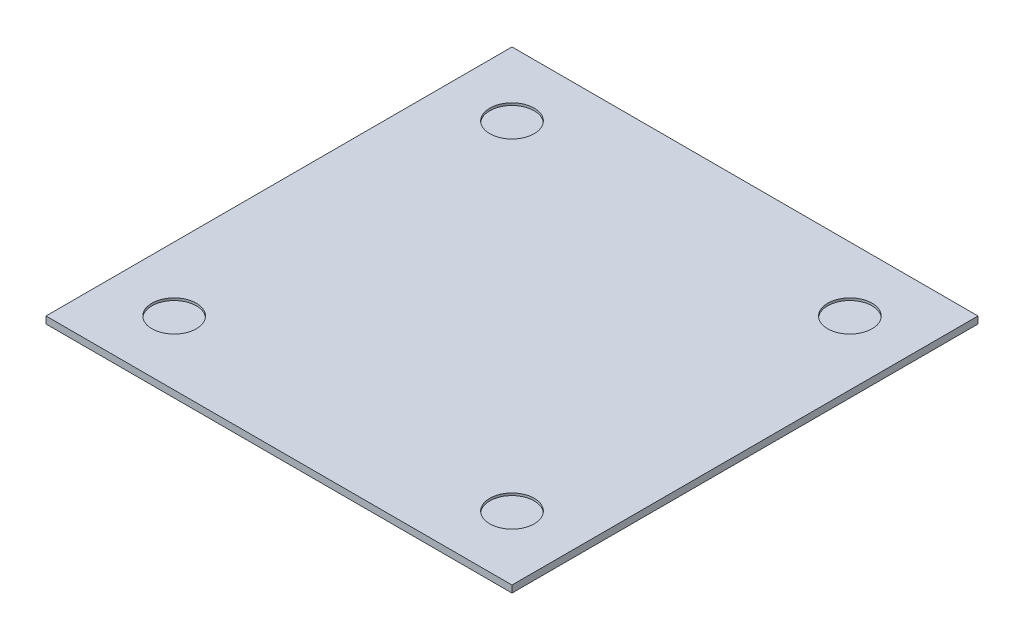
ISO-10303-21;
HEADER;
FILE_DESCRIPTION(('STEP AP214'),'2;1');
FILE_NAME('part.step','',(''),(''),'','','');
FILE_SCHEMA(('AUTOMOTIVE_DESIGN { 1 0 10303 214 1 1 1 1 }'));
ENDSEC;
DATA;
#1=APPLICATION_CONTEXT('core data for automotive mechanical design processes');
#2=APPLICATION_PROTOCOL_DEFINITION('international standard','automotive_design',2000,#1);
#3=PRODUCT_CONTEXT('',#1,'mechanical');
#4=PRODUCT('Part','Part','',(#3));
#5=PRODUCT_RELATED_PRODUCT_CATEGORY('part','',(#4));
#6=PRODUCT_DEFINITION_FORMATION('','',#4);
#7=PRODUCT_DEFINITION_CONTEXT('part definition',#1,'design');
#8=PRODUCT_DEFINITION('design','',#6,#7);
#9=PRODUCT_DEFINITION_SHAPE('','',#8);
#10=(LENGTH_UNIT() NAMED_UNIT(*) SI_UNIT(.MILLI.,.METRE.));
#11=(NAMED_UNIT(*) PLANE_ANGLE_UNIT() SI_UNIT($,.RADIAN.));
#12=(NAMED_UNIT(*) SI_UNIT($,.STERADIAN.) SOLID_ANGLE_UNIT());
#13=UNCERTAINTY_MEASURE_WITH_UNIT(LENGTH_MEASURE(1.E-05),#10,'distance_accuracy_value','');
#14=(GEOMETRIC_REPRESENTATION_CONTEXT(3) GLOBAL_UNCERTAINTY_ASSIGNED_CONTEXT((#13)) GLOBAL_UNIT_ASSIGNED_CONTEXT((#10,
#11,#12)) REPRESENTATION_CONTEXT('',''));
#15=CARTESIAN_POINT('',(0.,0.,0.));
#16=DIRECTION('',(0.,0.,1.));
#17=DIRECTION('',(1.,0.,0.));
#18=AXIS2_PLACEMENT_3D('',#15,#16,#17);
#19=CARTESIAN_POINT('',(100.,3.,-100.));
#20=DIRECTION('',(-1.,0.,0.));
#21=DIRECTION('',(0.,0.,1.));
#22=AXIS2_PLACEMENT_3D('',#19,#20,#21);
#23=PLANE('',#22);
#24=DIRECTION('',(0.,0.,-1.));
#25=VECTOR('',#24,1.);
#26=CARTESIAN_POINT('',(100.,0.,-100.));
#27=LINE('',#26,#25);
#28=CARTESIAN_POINT('',(100.,0.,100.));
#29=VERTEX_POINT('',#28);
#30=CARTESIAN_POINT('',(100.,0.,-100.));
#31=VERTEX_POINT('',#30);
#32=EDGE_CURVE('E113',#29,#31,#27,.T.);
#33=ORIENTED_EDGE('',*,*,#32,.T.);
#34=DIRECTION('',(0.,-1.,0.));
#35=VECTOR('',#34,1.);
#36=CARTESIAN_POINT('',(100.,3.,-100.));
#37=LINE('',#36,#35);
#38=CARTESIAN_POINT('',(100.,3.,-100.));
#39=VERTEX_POINT('',#38);
#40=EDGE_CURVE('E11',#39,#31,#37,.T.);
#41=ORIENTED_EDGE('',*,*,#40,.F.);
#42=DIRECTION('',(0.,0.,-1.));
#43=VECTOR('',#42,1.);
#44=CARTESIAN_POINT('',(100.,3.,-100.));
#45=LINE('',#44,#43);
#46=CARTESIAN_POINT('',(100.,3.,100.));
#47=VERTEX_POINT('',#46);
#48=EDGE_CURVE('E97',#47,#39,#45,.T.);
#49=ORIENTED_EDGE('',*,*,#48,.F.);
#50=DIRECTION('',(0.,-1.,0.));
#51=VECTOR('',#50,1.);
#52=CARTESIAN_POINT('',(100.,3.,100.));
#53=LINE('',#52,#51);
#54=EDGE_CURVE('E109',#47,#29,#53,.T.);
#55=ORIENTED_EDGE('',*,*,#54,.T.);
#56=EDGE_LOOP('',(#33,#41,#49,#55));
#57=FACE_BOUND('',#56,.T.);
#58=ADVANCED_FACE('F45',(#57),#23,.F.);
#59=CARTESIAN_POINT('',(-100.,3.,-100.));
#60=DIRECTION('',(0.,0.,1.));
#61=DIRECTION('',(1.,0.,0.));
#62=AXIS2_PLACEMENT_3D('',#59,#60,#61);
#63=PLANE('',#62);
#64=DIRECTION('',(-1.,0.,0.));
#65=VECTOR('',#64,1.);
#66=CARTESIAN_POINT('',(-100.,0.,-100.));
#67=LINE('',#66,#65);
#68=CARTESIAN_POINT('',(-100.,0.,-100.));
#69=VERTEX_POINT('',#68);
#70=EDGE_CURVE('E102',#31,#69,#67,.T.);
#71=ORIENTED_EDGE('',*,*,#70,.T.);
#72=DIRECTION('',(0.,-1.,0.));
#73=VECTOR('',#72,1.);
#74=CARTESIAN_POINT('',(-100.,3.,-100.));
#75=LINE('',#74,#73);
#76=CARTESIAN_POINT('',(-100.,3.,-100.));
#77=VERTEX_POINT('',#76);
#78=EDGE_CURVE('E54',#77,#69,#75,.T.);
#79=ORIENTED_EDGE('',*,*,#78,.F.);
#80=DIRECTION('',(-1.,0.,0.));
#81=VECTOR('',#80,1.);
#82=CARTESIAN_POINT('',(-100.,3.,-100.));
#83=LINE('',#82,#81);
#84=EDGE_CURVE('E92',#39,#77,#83,.T.);
#85=ORIENTED_EDGE('',*,*,#84,.F.);
#86=ORIENTED_EDGE('',*,*,#40,.T.);
#87=EDGE_LOOP('',(#71,#79,#85,#86));
#88=FACE_BOUND('',#87,.T.);
#89=ADVANCED_FACE('F101',(#88),#63,.F.);
#90=CARTESIAN_POINT('',(-100.,3.,-100.));
#91=DIRECTION('',(1.,0.,0.));
#92=DIRECTION('',(0.,0.,-1.));
#93=AXIS2_PLACEMENT_3D('',#90,#91,#92);
#94=PLANE('',#93);
#95=DIRECTION('',(0.,0.,1.));
#96=VECTOR('',#95,1.);
#97=CARTESIAN_POINT('',(-100.,0.,-100.));
#98=LINE('',#97,#96);
#99=CARTESIAN_POINT('',(-100.,0.,100.));
#100=VERTEX_POINT('',#99);
#101=EDGE_CURVE('E79',#69,#100,#98,.T.);
#102=ORIENTED_EDGE('',*,*,#101,.T.);
#103=DIRECTION('',(0.,-1.,0.));
#104=VECTOR('',#103,1.);
#105=CARTESIAN_POINT('',(-100.,3.,100.));
#106=LINE('',#105,#104);
#107=CARTESIAN_POINT('',(-100.,3.,100.));
#108=VERTEX_POINT('',#107);
#109=EDGE_CURVE('E104',#108,#100,#106,.T.);
#110=ORIENTED_EDGE('',*,*,#109,.F.);
#111=DIRECTION('',(0.,0.,1.));
#112=VECTOR('',#111,1.);
#113=CARTESIAN_POINT('',(-100.,3.,-100.));
#114=LINE('',#113,#112);
#115=EDGE_CURVE('E95',#77,#108,#114,.T.);
#116=ORIENTED_EDGE('',*,*,#115,.F.);
#117=ORIENTED_EDGE('',*,*,#78,.T.);
#118=EDGE_LOOP('',(#102,#110,#116,#117));
#119=FACE_BOUND('',#118,.T.);
#120=ADVANCED_FACE('F105',(#119),#94,.F.);
#121=CARTESIAN_POINT('',(-100.,3.,100.));
#122=DIRECTION('',(0.,0.,-1.));
#123=DIRECTION('',(-1.,0.,0.));
#124=AXIS2_PLACEMENT_3D('',#121,#122,#123);
#125=PLANE('',#124);
#126=DIRECTION('',(1.,0.,0.));
#127=VECTOR('',#126,1.);
#128=CARTESIAN_POINT('',(-100.,0.,100.));
#129=LINE('',#128,#127);
#130=EDGE_CURVE('E85',#100,#29,#129,.T.);
#131=ORIENTED_EDGE('',*,*,#130,.T.);
#132=ORIENTED_EDGE('',*,*,#54,.F.);
#133=DIRECTION('',(1.,0.,0.));
#134=VECTOR('',#133,1.);
#135=CARTESIAN_POINT('',(-100.,3.,100.));
#136=LINE('',#135,#134);
#137=EDGE_CURVE('E62',#108,#47,#136,.T.);
#138=ORIENTED_EDGE('',*,*,#137,.F.);
#139=ORIENTED_EDGE('',*,*,#109,.T.);
#140=EDGE_LOOP('',(#131,#132,#138,#139));
#141=FACE_BOUND('',#140,.T.);
#142=ADVANCED_FACE('F127',(#141),#125,.F.);
#143=CARTESIAN_POINT('',(0.,3.,0.));
#144=DIRECTION('',(0.,1.,0.));
#145=DIRECTION('',(0.,0.,1.));
#146=AXIS2_PLACEMENT_3D('',#143,#144,#145);
#147=PLANE('',#146);
#148=CARTESIAN_POINT('',(-72.5054267325721,3.,72.5054267325721));
#149=DIRECTION('',(0.,1.,0.));
#150=DIRECTION('',(0.,0.,1.));
#151=AXIS2_PLACEMENT_3D('',#148,#149,#150);
#152=CIRCLE('',#151,9.52500000000001);
#153=CARTESIAN_POINT('',(-72.5054267325721,3.,82.0304267325721));
#154=VERTEX_POINT('',#153);
#155=EDGE_CURVE('E146',#154,#154,#152,.T.);
#156=ORIENTED_EDGE('',*,*,#155,.F.);
#157=EDGE_LOOP('',(#156));
#158=FACE_BOUND('',#157,.T.);
#159=CARTESIAN_POINT('',(72.505426732572,3.,72.5054267325719));
#160=DIRECTION('',(0.,1.,0.));
#161=DIRECTION('',(0.,0.,1.));
#162=AXIS2_PLACEMENT_3D('',#159,#160,#161);
#163=CIRCLE('',#162,9.52500000000001);
#164=CARTESIAN_POINT('',(72.505426732572,3.,82.030426732572));
#165=VERTEX_POINT('',#164);
#166=EDGE_CURVE('E154',#165,#165,#163,.T.);
#167=ORIENTED_EDGE('',*,*,#166,.F.);
#168=EDGE_LOOP('',(#167));
#169=FACE_BOUND('',#168,.T.);
#170=CARTESIAN_POINT('',(72.505426732572,3.,-72.5054267325721));
#171=DIRECTION('',(0.,1.,0.));
#172=DIRECTION('',(0.,0.,1.));
#173=AXIS2_PLACEMENT_3D('',#170,#171,#172);
#174=CIRCLE('',#173,9.52500000000001);
#175=CARTESIAN_POINT('',(72.505426732572,3.,-62.980426732572));
#176=VERTEX_POINT('',#175);
#177=EDGE_CURVE('E138',#176,#176,#174,.T.);
#178=ORIENTED_EDGE('',*,*,#177,.F.);
#179=EDGE_LOOP('',(#178));
#180=FACE_BOUND('',#179,.T.);
#181=CARTESIAN_POINT('',(-72.5054267325721,3.,-72.5054267325721));
#182=DIRECTION('',(0.,1.,0.));
#183=DIRECTION('',(0.,0.,1.));
#184=AXIS2_PLACEMENT_3D('',#181,#182,#183);
#185=CIRCLE('',#184,9.52500000000001);
#186=CARTESIAN_POINT('',(-72.5054267325721,3.,-62.9804267325721));
#187=VERTEX_POINT('',#186);
#188=EDGE_CURVE('E134',#187,#187,#185,.T.);
#189=ORIENTED_EDGE('',*,*,#188,.F.);
#190=EDGE_LOOP('',(#189));
#191=FACE_BOUND('',#190,.T.);
#192=ORIENTED_EDGE('',*,*,#48,.T.);
#193=ORIENTED_EDGE('',*,*,#84,.T.);
#194=ORIENTED_EDGE('',*,*,#115,.T.);
#195=ORIENTED_EDGE('',*,*,#137,.T.);
#196=EDGE_LOOP('',(#192,#193,#194,#195));
#197=FACE_BOUND('',#196,.T.);
#198=ADVANCED_FACE('F93',(#158,#169,#180,#191,#197),#147,.T.);
#199=CARTESIAN_POINT('',(0.,0.,0.));
#200=DIRECTION('',(0.,1.,0.));
#201=DIRECTION('',(0.,0.,1.));
#202=AXIS2_PLACEMENT_3D('',#199,#200,#201);
#203=PLANE('',#202);
#204=ORIENTED_EDGE('',*,*,#32,.F.);
#205=ORIENTED_EDGE('',*,*,#130,.F.);
#206=ORIENTED_EDGE('',*,*,#101,.F.);
#207=ORIENTED_EDGE('',*,*,#70,.F.);
#208=EDGE_LOOP('',(#204,#205,#206,#207));
#209=FACE_BOUND('',#208,.T.);
#210=ADVANCED_FACE('F130',(#209),#203,.F.);
#211=CARTESIAN_POINT('',(-72.5054267325721,2.,-72.5054267325721));
#212=DIRECTION('',(0.,1.,0.));
#213=DIRECTION('',(0.,0.,1.));
#214=AXIS2_PLACEMENT_3D('',#211,#212,#213);
#215=CYLINDRICAL_SURFACE('',#214,9.52500000000001);
#216=CARTESIAN_POINT('',(-72.5054267325721,2.,-72.5054267325721));
#217=DIRECTION('',(0.,1.,0.));
#218=DIRECTION('',(0.,0.,1.));
#219=AXIS2_PLACEMENT_3D('',#216,#217,#218);
#220=CIRCLE('',#219,9.52500000000001);
#221=CARTESIAN_POINT('',(-72.5054267325721,2.,-62.9804267325721));
#222=VERTEX_POINT('',#221);
#223=EDGE_CURVE('E117',#222,#222,#220,.T.);
#224=ORIENTED_EDGE('',*,*,#223,.F.);
#225=EDGE_LOOP('',(#224));
#226=FACE_BOUND('',#225,.T.);
#227=ORIENTED_EDGE('',*,*,#188,.T.);
#228=EDGE_LOOP('',(#227));
#229=FACE_BOUND('',#228,.T.);
#230=ADVANCED_FACE('F174',(#226,#229),#215,.F.);
#231=CARTESIAN_POINT('',(-72.5054267325721,2.,-72.5054267325721));
#232=DIRECTION('',(0.,1.,0.));
#233=DIRECTION('',(0.,0.,1.));
#234=AXIS2_PLACEMENT_3D('',#231,#232,#233);
#235=PLANE('',#234);
#236=ORIENTED_EDGE('',*,*,#223,.T.);
#237=EDGE_LOOP('',(#236));
#238=FACE_BOUND('',#237,.T.);
#239=ADVANCED_FACE('F176',(#238),#235,.T.);
#240=CARTESIAN_POINT('',(72.505426732572,2.,-72.5054267325721));
#241=DIRECTION('',(0.,1.,0.));
#242=DIRECTION('',(0.,0.,1.));
#243=AXIS2_PLACEMENT_3D('',#240,#241,#242);
#244=CYLINDRICAL_SURFACE('',#243,9.52500000000001);
#245=CARTESIAN_POINT('',(72.505426732572,2.,-72.5054267325721));
#246=DIRECTION('',(0.,1.,0.));
#247=DIRECTION('',(0.,0.,1.));
#248=AXIS2_PLACEMENT_3D('',#245,#246,#247);
#249=CIRCLE('',#248,9.52500000000001);
#250=CARTESIAN_POINT('',(72.505426732572,2.,-62.980426732572));
#251=VERTEX_POINT('',#250);
#252=EDGE_CURVE('E158',#251,#251,#249,.T.);
#253=ORIENTED_EDGE('',*,*,#252,.F.);
#254=EDGE_LOOP('',(#253));
#255=FACE_BOUND('',#254,.T.);
#256=ORIENTED_EDGE('',*,*,#177,.T.);
#257=EDGE_LOOP('',(#256));
#258=FACE_BOUND('',#257,.T.);
#259=ADVANCED_FACE('F166',(#255,#258),#244,.F.);
#260=CARTESIAN_POINT('',(72.505426732572,2.,-72.5054267325721));
#261=DIRECTION('',(0.,1.,0.));
#262=DIRECTION('',(0.,0.,1.));
#263=AXIS2_PLACEMENT_3D('',#260,#261,#262);
#264=PLANE('',#263);
#265=ORIENTED_EDGE('',*,*,#252,.T.);
#266=EDGE_LOOP('',(#265));
#267=FACE_BOUND('',#266,.T.);
#268=ADVANCED_FACE('F232',(#267),#264,.T.);
#269=CARTESIAN_POINT('',(72.505426732572,2.,72.5054267325719));
#270=DIRECTION('',(0.,1.,0.));
#271=DIRECTION('',(0.,0.,1.));
#272=AXIS2_PLACEMENT_3D('',#269,#270,#271);
#273=CYLINDRICAL_SURFACE('',#272,9.52500000000001);
#274=CARTESIAN_POINT('',(72.505426732572,2.,72.5054267325719));
#275=DIRECTION('',(0.,1.,0.));
#276=DIRECTION('',(0.,0.,1.));
#277=AXIS2_PLACEMENT_3D('',#274,#275,#276);
#278=CIRCLE('',#277,9.52500000000001);
#279=CARTESIAN_POINT('',(72.505426732572,2.,82.030426732572));
#280=VERTEX_POINT('',#279);
#281=EDGE_CURVE('E150',#280,#280,#278,.T.);
#282=ORIENTED_EDGE('',*,*,#281,.F.);
#283=EDGE_LOOP('',(#282));
#284=FACE_BOUND('',#283,.T.);
#285=ORIENTED_EDGE('',*,*,#166,.T.);
#286=EDGE_LOOP('',(#285));
#287=FACE_BOUND('',#286,.T.);
#288=ADVANCED_FACE('F241',(#284,#287),#273,.F.);
#289=CARTESIAN_POINT('',(72.505426732572,2.,72.5054267325719));
#290=DIRECTION('',(0.,1.,0.));
#291=DIRECTION('',(0.,0.,1.));
#292=AXIS2_PLACEMENT_3D('',#289,#290,#291);
#293=PLANE('',#292);
#294=ORIENTED_EDGE('',*,*,#281,.T.);
#295=EDGE_LOOP('',(#294));
#296=FACE_BOUND('',#295,.T.);
#297=ADVANCED_FACE('F250',(#296),#293,.T.);
#298=CARTESIAN_POINT('',(-72.5054267325721,2.,72.5054267325721));
#299=DIRECTION('',(0.,1.,0.));
#300=DIRECTION('',(0.,0.,1.));
#301=AXIS2_PLACEMENT_3D('',#298,#299,#300);
#302=CYLINDRICAL_SURFACE('',#301,9.52500000000001);
#303=CARTESIAN_POINT('',(-72.5054267325721,2.,72.5054267325721));
#304=DIRECTION('',(0.,1.,0.));
#305=DIRECTION('',(0.,0.,1.));
#306=AXIS2_PLACEMENT_3D('',#303,#304,#305);
#307=CIRCLE('',#306,9.52500000000001);
#308=CARTESIAN_POINT('',(-72.5054267325721,2.,82.0304267325721));
#309=VERTEX_POINT('',#308);
#310=EDGE_CURVE('E142',#309,#309,#307,.T.);
#311=ORIENTED_EDGE('',*,*,#310,.F.);
#312=EDGE_LOOP('',(#311));
#313=FACE_BOUND('',#312,.T.);
#314=ORIENTED_EDGE('',*,*,#155,.T.);
#315=EDGE_LOOP('',(#314));
#316=FACE_BOUND('',#315,.T.);
#317=ADVANCED_FACE('F259',(#313,#316),#302,.F.);
#318=CARTESIAN_POINT('',(-72.5054267325721,2.,72.5054267325721));
#319=DIRECTION('',(0.,1.,0.));
#320=DIRECTION('',(0.,0.,1.));
#321=AXIS2_PLACEMENT_3D('',#318,#319,#320);
#322=PLANE('',#321);
#323=ORIENTED_EDGE('',*,*,#310,.T.);
#324=EDGE_LOOP('',(#323));
#325=FACE_BOUND('',#324,.T.);
#326=ADVANCED_FACE('F268',(#325),#322,.T.);
#327=CLOSED_SHELL('',(#58,#89,#120,#142,#198,#210,#230,#239,#259,#268,#288,#297,#317,#326));
#328=MANIFOLD_SOLID_BREP('B2',#327);
#329=ADVANCED_BREP_SHAPE_REPRESENTATION('',(#18,#328),#14);
#330=SHAPE_DEFINITION_REPRESENTATION(#9,#329);
ENDSEC;
END-ISO-10303-21;
